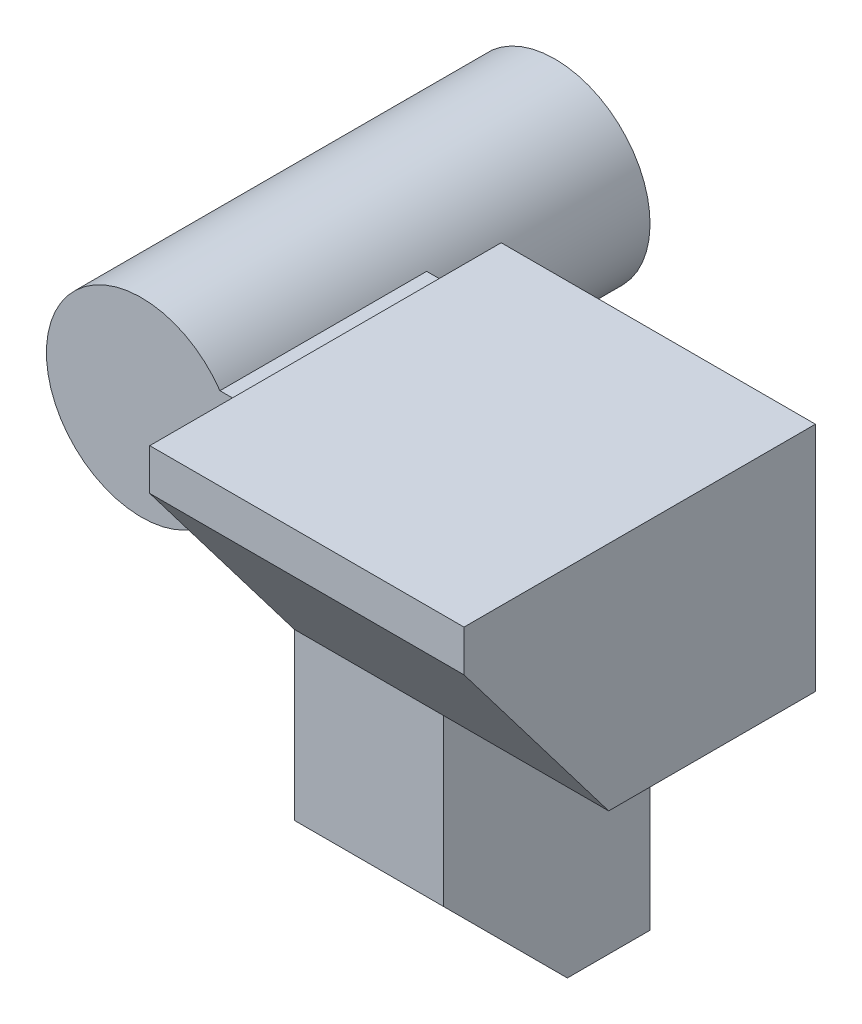
ISO-10303-21;
HEADER;
FILE_DESCRIPTION(('STEP AP214'),'2;1');
FILE_NAME('part.step','',(''),(''),'','','');
FILE_SCHEMA(('AUTOMOTIVE_DESIGN { 1 0 10303 214 1 1 1 1 }'));
ENDSEC;
DATA;
#1=APPLICATION_CONTEXT('core data for automotive mechanical design processes');
#2=APPLICATION_PROTOCOL_DEFINITION('international standard','automotive_design',2000,#1);
#3=PRODUCT_CONTEXT('',#1,'mechanical');
#4=PRODUCT('Part','Part','',(#3));
#5=PRODUCT_RELATED_PRODUCT_CATEGORY('part','',(#4));
#6=PRODUCT_DEFINITION_FORMATION('','',#4);
#7=PRODUCT_DEFINITION_CONTEXT('part definition',#1,'design');
#8=PRODUCT_DEFINITION('design','',#6,#7);
#9=PRODUCT_DEFINITION_SHAPE('','',#8);
#10=(LENGTH_UNIT() NAMED_UNIT(*) SI_UNIT(.MILLI.,.METRE.));
#11=(NAMED_UNIT(*) PLANE_ANGLE_UNIT() SI_UNIT($,.RADIAN.));
#12=(NAMED_UNIT(*) SI_UNIT($,.STERADIAN.) SOLID_ANGLE_UNIT());
#13=UNCERTAINTY_MEASURE_WITH_UNIT(LENGTH_MEASURE(1.E-05),#10,'distance_accuracy_value','');
#14=(GEOMETRIC_REPRESENTATION_CONTEXT(3) GLOBAL_UNCERTAINTY_ASSIGNED_CONTEXT((#13)) GLOBAL_UNIT_ASSIGNED_CONTEXT((#10,
#11,#12)) REPRESENTATION_CONTEXT('',''));
#15=CARTESIAN_POINT('',(0.,0.,0.));
#16=DIRECTION('',(0.,0.,1.));
#17=DIRECTION('',(1.,0.,0.));
#18=AXIS2_PLACEMENT_3D('',#15,#16,#17);
#19=CARTESIAN_POINT('',(0.,0.,5.));
#20=DIRECTION('',(0.,0.,1.));
#21=DIRECTION('',(1.,0.,0.));
#22=AXIS2_PLACEMENT_3D('',#19,#20,#21);
#23=PLANE('',#22);
#24=DIRECTION('',(1.,0.,0.));
#25=VECTOR('',#24,1.);
#26=CARTESIAN_POINT('',(0.,-1.3,5.));
#27=LINE('',#26,#25);
#28=CARTESIAN_POINT('',(-5.60263340389896,-1.3,5.));
#29=VERTEX_POINT('',#28);
#30=CARTESIAN_POINT('',(-3.8,-1.3,5.));
#31=VERTEX_POINT('',#30);
#32=EDGE_CURVE('E203',#29,#31,#27,.T.);
#33=ORIENTED_EDGE('',*,*,#32,.T.);
#34=DIRECTION('',(0.,1.,0.));
#35=VECTOR('',#34,1.);
#36=CARTESIAN_POINT('',(-3.8,-2.8,5.));
#37=LINE('',#36,#35);
#38=CARTESIAN_POINT('',(-3.8,1.3,5.));
#39=VERTEX_POINT('',#38);
#40=EDGE_CURVE('E11',#31,#39,#37,.T.);
#41=ORIENTED_EDGE('',*,*,#40,.T.);
#42=DIRECTION('',(1.,0.,0.));
#43=VECTOR('',#42,1.);
#44=CARTESIAN_POINT('',(0.,1.3,5.));
#45=LINE('',#44,#43);
#46=CARTESIAN_POINT('',(-5.60263340389896,1.3,5.));
#47=VERTEX_POINT('',#46);
#48=EDGE_CURVE('E198',#47,#39,#45,.T.);
#49=ORIENTED_EDGE('',*,*,#48,.F.);
#50=CARTESIAN_POINT('',(-7.49999999999999,0.,5.));
#51=DIRECTION('',(0.,0.,1.));
#52=DIRECTION('',(1.,0.,0.));
#53=AXIS2_PLACEMENT_3D('',#50,#51,#52);
#54=CIRCLE('',#53,2.3);
#55=EDGE_CURVE('E191',#47,#29,#54,.T.);
#56=ORIENTED_EDGE('',*,*,#55,.T.);
#57=EDGE_LOOP('',(#33,#41,#49,#56));
#58=FACE_BOUND('',#57,.T.);
#59=ADVANCED_FACE('F43',(#58),#23,.T.);
#60=CARTESIAN_POINT('',(0.,0.,0.));
#61=DIRECTION('',(0.,0.,1.));
#62=DIRECTION('',(1.,0.,0.));
#63=AXIS2_PLACEMENT_3D('',#60,#61,#62);
#64=PLANE('',#63);
#65=CARTESIAN_POINT('',(-7.49999999999999,0.,0.));
#66=DIRECTION('',(0.,0.,-1.));
#67=DIRECTION('',(-1.,0.,0.));
#68=AXIS2_PLACEMENT_3D('',#65,#66,#67);
#69=CIRCLE('',#68,2.3);
#70=CARTESIAN_POINT('',(-5.60263340389896,1.3,0.));
#71=VERTEX_POINT('',#70);
#72=CARTESIAN_POINT('',(-5.60263340389896,-1.3,0.));
#73=VERTEX_POINT('',#72);
#74=EDGE_CURVE('E173',#71,#73,#69,.T.);
#75=ORIENTED_EDGE('',*,*,#74,.F.);
#76=DIRECTION('',(1.,0.,0.));
#77=VECTOR('',#76,1.);
#78=CARTESIAN_POINT('',(0.,1.3,0.));
#79=LINE('',#78,#77);
#80=CARTESIAN_POINT('',(-3.8,1.3,0.));
#81=VERTEX_POINT('',#80);
#82=EDGE_CURVE('E197',#71,#81,#79,.T.);
#83=ORIENTED_EDGE('',*,*,#82,.T.);
#84=DIRECTION('',(0.,-1.,0.));
#85=VECTOR('',#84,1.);
#86=CARTESIAN_POINT('',(-3.8,2.8,0.));
#87=LINE('',#86,#85);
#88=CARTESIAN_POINT('',(-3.8,2.8,0.));
#89=VERTEX_POINT('',#88);
#90=EDGE_CURVE('E226',#89,#81,#87,.T.);
#91=ORIENTED_EDGE('',*,*,#90,.F.);
#92=DIRECTION('',(-1.,0.,0.));
#93=VECTOR('',#92,1.);
#94=CARTESIAN_POINT('',(-3.8,2.8,0.));
#95=LINE('',#94,#93);
#96=CARTESIAN_POINT('',(3.8,2.8,0.));
#97=VERTEX_POINT('',#96);
#98=EDGE_CURVE('E145',#97,#89,#95,.T.);
#99=ORIENTED_EDGE('',*,*,#98,.F.);
#100=DIRECTION('',(0.,1.,0.));
#101=VECTOR('',#100,1.);
#102=CARTESIAN_POINT('',(3.8,2.8,0.));
#103=LINE('',#102,#101);
#104=CARTESIAN_POINT('',(3.8,-2.8,0.));
#105=VERTEX_POINT('',#104);
#106=EDGE_CURVE('E210',#105,#97,#103,.T.);
#107=ORIENTED_EDGE('',*,*,#106,.F.);
#108=DIRECTION('',(1.,0.,0.));
#109=VECTOR('',#108,1.);
#110=CARTESIAN_POINT('',(-3.8,-2.8,0.));
#111=LINE('',#110,#109);
#112=CARTESIAN_POINT('',(-0.200000000000001,-2.8,0.));
#113=VERTEX_POINT('',#112);
#114=EDGE_CURVE('E219',#113,#105,#111,.T.);
#115=ORIENTED_EDGE('',*,*,#114,.F.);
#116=DIRECTION('',(0.,1.,0.));
#117=VECTOR('',#116,1.);
#118=CARTESIAN_POINT('',(-0.2,-9.8,0.));
#119=LINE('',#118,#117);
#120=CARTESIAN_POINT('',(-0.2,-9.8,0.));
#121=VERTEX_POINT('',#120);
#122=EDGE_CURVE('E183',#121,#113,#119,.T.);
#123=ORIENTED_EDGE('',*,*,#122,.F.);
#124=DIRECTION('',(1.,0.,0.));
#125=VECTOR('',#124,1.);
#126=CARTESIAN_POINT('',(-3.8,-9.8,0.));
#127=LINE('',#126,#125);
#128=CARTESIAN_POINT('',(-3.8,-9.8,0.));
#129=VERTEX_POINT('',#128);
#130=EDGE_CURVE('E180',#129,#121,#127,.T.);
#131=ORIENTED_EDGE('',*,*,#130,.F.);
#132=CARTESIAN_POINT('',(-3.8,-1.3,0.));
#133=VERTEX_POINT('',#132);
#134=EDGE_CURVE('E225',#133,#129,#87,.T.);
#135=ORIENTED_EDGE('',*,*,#134,.F.);
#136=DIRECTION('',(1.,0.,0.));
#137=VECTOR('',#136,1.);
#138=CARTESIAN_POINT('',(0.,-1.3,0.));
#139=LINE('',#138,#137);
#140=EDGE_CURVE('E195',#73,#133,#139,.T.);
#141=ORIENTED_EDGE('',*,*,#140,.F.);
#142=EDGE_LOOP('',(#75,#83,#91,#99,#107,#115,#123,#131,#135,#141));
#143=FACE_BOUND('',#142,.T.);
#144=ADVANCED_FACE('F255',(#143),#64,.F.);
#145=CARTESIAN_POINT('',(-3.8,-2.8,5.));
#146=DIRECTION('',(0.,1.,0.));
#147=DIRECTION('',(0.,0.,1.));
#148=AXIS2_PLACEMENT_3D('',#145,#146,#147);
#149=PLANE('',#148);
#150=DIRECTION('',(0.,0.,1.));
#151=VECTOR('',#150,1.);
#152=CARTESIAN_POINT('',(-0.2,-2.8,0.));
#153=LINE('',#152,#151);
#154=CARTESIAN_POINT('',(-0.2,-2.8,5.));
#155=VERTEX_POINT('',#154);
#156=EDGE_CURVE('E188',#113,#155,#153,.T.);
#157=ORIENTED_EDGE('',*,*,#156,.F.);
#158=ORIENTED_EDGE('',*,*,#114,.T.);
#159=DIRECTION('',(0.,0.,-1.));
#160=VECTOR('',#159,1.);
#161=CARTESIAN_POINT('',(3.8,-2.8,5.));
#162=LINE('',#161,#160);
#163=CARTESIAN_POINT('',(3.8,-2.8,5.));
#164=VERTEX_POINT('',#163);
#165=EDGE_CURVE('E151',#164,#105,#162,.T.);
#166=ORIENTED_EDGE('',*,*,#165,.F.);
#167=DIRECTION('',(1.,0.,0.));
#168=VECTOR('',#167,1.);
#169=CARTESIAN_POINT('',(-3.8,-2.8,5.));
#170=LINE('',#169,#168);
#171=EDGE_CURVE('E218',#155,#164,#170,.T.);
#172=ORIENTED_EDGE('',*,*,#171,.F.);
#173=EDGE_LOOP('',(#157,#158,#166,#172));
#174=FACE_BOUND('',#173,.T.);
#175=ADVANCED_FACE('F292',(#174),#149,.F.);
#176=CARTESIAN_POINT('',(3.8,2.8,5.));
#177=DIRECTION('',(-1.,0.,0.));
#178=DIRECTION('',(0.,-1.,0.));
#179=AXIS2_PLACEMENT_3D('',#176,#177,#178);
#180=PLANE('',#179);
#181=ORIENTED_EDGE('',*,*,#106,.T.);
#182=DIRECTION('',(0.,0.,-1.));
#183=VECTOR('',#182,1.);
#184=CARTESIAN_POINT('',(3.8,2.8,5.));
#185=LINE('',#184,#183);
#186=CARTESIAN_POINT('',(3.8,2.8,8.5));
#187=VERTEX_POINT('',#186);
#188=EDGE_CURVE('E150',#187,#97,#185,.T.);
#189=ORIENTED_EDGE('',*,*,#188,.F.);
#190=DIRECTION('',(0.,-1.,0.));
#191=VECTOR('',#190,1.);
#192=CARTESIAN_POINT('',(3.8,2.8,8.5));
#193=LINE('',#192,#191);
#194=CARTESIAN_POINT('',(3.8,1.8,8.5));
#195=VERTEX_POINT('',#194);
#196=EDGE_CURVE('E159',#187,#195,#193,.T.);
#197=ORIENTED_EDGE('',*,*,#196,.T.);
#198=DIRECTION('',(0.,-0.795828694120859,-0.605521832483262));
#199=VECTOR('',#198,1.);
#200=CARTESIAN_POINT('',(3.8,1.8,8.5));
#201=LINE('',#200,#199);
#202=EDGE_CURVE('E165',#195,#164,#201,.T.);
#203=ORIENTED_EDGE('',*,*,#202,.T.);
#204=ORIENTED_EDGE('',*,*,#165,.T.);
#205=EDGE_LOOP('',(#181,#189,#197,#203,#204));
#206=FACE_BOUND('',#205,.T.);
#207=ADVANCED_FACE('F252',(#206),#180,.F.);
#208=CARTESIAN_POINT('',(-3.8,2.8,5.));
#209=DIRECTION('',(0.,-1.,0.));
#210=DIRECTION('',(0.,0.,-1.));
#211=AXIS2_PLACEMENT_3D('',#208,#209,#210);
#212=PLANE('',#211);
#213=ORIENTED_EDGE('',*,*,#98,.T.);
#214=DIRECTION('',(0.,0.,-1.));
#215=VECTOR('',#214,1.);
#216=CARTESIAN_POINT('',(-3.8,2.8,5.));
#217=LINE('',#216,#215);
#218=CARTESIAN_POINT('',(-3.8,2.8,8.5));
#219=VERTEX_POINT('',#218);
#220=EDGE_CURVE('E139',#219,#89,#217,.T.);
#221=ORIENTED_EDGE('',*,*,#220,.F.);
#222=DIRECTION('',(1.,0.,0.));
#223=VECTOR('',#222,1.);
#224=CARTESIAN_POINT('',(-3.8,2.8,8.5));
#225=LINE('',#224,#223);
#226=EDGE_CURVE('E143',#219,#187,#225,.T.);
#227=ORIENTED_EDGE('',*,*,#226,.T.);
#228=ORIENTED_EDGE('',*,*,#188,.T.);
#229=EDGE_LOOP('',(#213,#221,#227,#228));
#230=FACE_BOUND('',#229,.T.);
#231=ADVANCED_FACE('F141',(#230),#212,.F.);
#232=CARTESIAN_POINT('',(-3.8,2.8,5.));
#233=DIRECTION('',(1.,0.,0.));
#234=DIRECTION('',(0.,1.,0.));
#235=AXIS2_PLACEMENT_3D('',#232,#233,#234);
#236=PLANE('',#235);
#237=ORIENTED_EDGE('',*,*,#90,.T.);
#238=DIRECTION('',(0.,0.,1.));
#239=VECTOR('',#238,1.);
#240=CARTESIAN_POINT('',(-3.8,1.3,0.));
#241=LINE('',#240,#239);
#242=EDGE_CURVE('E211',#81,#39,#241,.T.);
#243=ORIENTED_EDGE('',*,*,#242,.T.);
#244=ORIENTED_EDGE('',*,*,#40,.F.);
#245=DIRECTION('',(0.,0.,1.));
#246=VECTOR('',#245,1.);
#247=CARTESIAN_POINT('',(-3.8,-1.3,0.));
#248=LINE('',#247,#246);
#249=EDGE_CURVE('E213',#133,#31,#248,.T.);
#250=ORIENTED_EDGE('',*,*,#249,.F.);
#251=ORIENTED_EDGE('',*,*,#134,.T.);
#252=DIRECTION('',(0.,0.,1.));
#253=VECTOR('',#252,1.);
#254=CARTESIAN_POINT('',(-3.8,-9.8,0.));
#255=LINE('',#254,#253);
#256=CARTESIAN_POINT('',(-3.8,-9.8,1.99999999999999));
#257=VERTEX_POINT('',#256);
#258=EDGE_CURVE('E186',#129,#257,#255,.T.);
#259=ORIENTED_EDGE('',*,*,#258,.T.);
#260=DIRECTION('',(0.,-0.707106781186546,-0.707106781186549));
#261=VECTOR('',#260,1.);
#262=CARTESIAN_POINT('',(-3.8,-6.8,5.));
#263=LINE('',#262,#261);
#264=CARTESIAN_POINT('',(-3.8,-6.8,5.));
#265=VERTEX_POINT('',#264);
#266=EDGE_CURVE('E48',#257,#265,#263,.F.);
#267=ORIENTED_EDGE('',*,*,#266,.T.);
#268=DIRECTION('',(0.,-1.,0.));
#269=VECTOR('',#268,1.);
#270=CARTESIAN_POINT('',(-3.8,2.8,5.));
#271=LINE('',#270,#269);
#272=CARTESIAN_POINT('',(-3.8,-2.8,5.));
#273=VERTEX_POINT('',#272);
#274=EDGE_CURVE('E216',#273,#265,#271,.T.);
#275=ORIENTED_EDGE('',*,*,#274,.F.);
#276=DIRECTION('',(0.,-0.795828694120859,-0.605521832483262));
#277=VECTOR('',#276,1.);
#278=CARTESIAN_POINT('',(-3.8,1.8,8.5));
#279=LINE('',#278,#277);
#280=CARTESIAN_POINT('',(-3.8,1.8,8.5));
#281=VERTEX_POINT('',#280);
#282=EDGE_CURVE('E161',#281,#273,#279,.T.);
#283=ORIENTED_EDGE('',*,*,#282,.F.);
#284=DIRECTION('',(0.,-1.,0.));
#285=VECTOR('',#284,1.);
#286=CARTESIAN_POINT('',(-3.8,2.8,8.5));
#287=LINE('',#286,#285);
#288=EDGE_CURVE('E156',#219,#281,#287,.T.);
#289=ORIENTED_EDGE('',*,*,#288,.F.);
#290=ORIENTED_EDGE('',*,*,#220,.T.);
#291=EDGE_LOOP('',(#237,#243,#244,#250,#251,#259,#267,#275,#283,#289,#290));
#292=FACE_BOUND('',#291,.T.);
#293=ADVANCED_FACE('F163',(#292),#236,.F.);
#294=DIRECTION('',(1.,0.,0.));
#295=VECTOR('',#294,1.);
#296=CARTESIAN_POINT('',(-3.8,-2.8,5.));
#297=LINE('',#296,#295);
#298=EDGE_CURVE('E60',#273,#155,#297,.T.);
#299=ORIENTED_EDGE('',*,*,#298,.F.);
#300=ORIENTED_EDGE('',*,*,#274,.T.);
#301=DIRECTION('',(1.,0.,0.));
#302=VECTOR('',#301,1.);
#303=CARTESIAN_POINT('',(0.,-6.8,5.));
#304=LINE('',#303,#302);
#305=CARTESIAN_POINT('',(-0.2,-6.8,5.));
#306=VERTEX_POINT('',#305);
#307=EDGE_CURVE('E232',#265,#306,#304,.T.);
#308=ORIENTED_EDGE('',*,*,#307,.T.);
#309=DIRECTION('',(0.,1.,0.));
#310=VECTOR('',#309,1.);
#311=CARTESIAN_POINT('',(-0.2,-9.8,5.));
#312=LINE('',#311,#310);
#313=EDGE_CURVE('E178',#306,#155,#312,.T.);
#314=ORIENTED_EDGE('',*,*,#313,.T.);
#315=EDGE_LOOP('',(#299,#300,#308,#314));
#316=FACE_BOUND('',#315,.T.);
#317=ADVANCED_FACE('F241',(#316),#23,.T.);
#318=CARTESIAN_POINT('',(-7.49999999999999,0.,0.));
#319=DIRECTION('',(0.,0.,1.));
#320=DIRECTION('',(1.,0.,0.));
#321=AXIS2_PLACEMENT_3D('',#318,#319,#320);
#322=CYLINDRICAL_SURFACE('',#321,2.3);
#323=ORIENTED_EDGE('',*,*,#55,.F.);
#324=DIRECTION('',(0.,0.,1.));
#325=VECTOR('',#324,1.);
#326=CARTESIAN_POINT('',(-5.60263340389896,1.3,0.));
#327=LINE('',#326,#325);
#328=EDGE_CURVE('E208',#71,#47,#327,.T.);
#329=ORIENTED_EDGE('',*,*,#328,.F.);
#330=ORIENTED_EDGE('',*,*,#74,.T.);
#331=DIRECTION('',(0.,0.,1.));
#332=VECTOR('',#331,1.);
#333=CARTESIAN_POINT('',(-5.60263340389896,-1.3,0.));
#334=LINE('',#333,#332);
#335=EDGE_CURVE('E200',#73,#29,#334,.T.);
#336=ORIENTED_EDGE('',*,*,#335,.T.);
#337=EDGE_LOOP('',(#323,#329,#330,#336));
#338=FACE_BOUND('',#337,.T.);
#339=CARTESIAN_POINT('',(-7.49999999999999,0.,-5.));
#340=DIRECTION('',(0.,0.,-1.));
#341=DIRECTION('',(-1.,0.,0.));
#342=AXIS2_PLACEMENT_3D('',#339,#340,#341);
#343=CIRCLE('',#342,2.3);
#344=CARTESIAN_POINT('',(-9.79999999999999,0.,-5.));
#345=VERTEX_POINT('',#344);
#346=EDGE_CURVE('E175',#345,#345,#343,.T.);
#347=ORIENTED_EDGE('',*,*,#346,.F.);
#348=EDGE_LOOP('',(#347));
#349=FACE_BOUND('',#348,.T.);
#350=ADVANCED_FACE('F296',(#338,#349),#322,.T.);
#351=CARTESIAN_POINT('',(0.,1.3,0.));
#352=DIRECTION('',(0.,-1.,0.));
#353=DIRECTION('',(0.,0.,-1.));
#354=AXIS2_PLACEMENT_3D('',#351,#352,#353);
#355=PLANE('',#354);
#356=ORIENTED_EDGE('',*,*,#48,.T.);
#357=ORIENTED_EDGE('',*,*,#242,.F.);
#358=ORIENTED_EDGE('',*,*,#82,.F.);
#359=ORIENTED_EDGE('',*,*,#328,.T.);
#360=EDGE_LOOP('',(#356,#357,#358,#359));
#361=FACE_BOUND('',#360,.T.);
#362=ADVANCED_FACE('F262',(#361),#355,.F.);
#363=CARTESIAN_POINT('',(0.,-1.3,0.));
#364=DIRECTION('',(0.,-1.,0.));
#365=DIRECTION('',(0.,0.,-1.));
#366=AXIS2_PLACEMENT_3D('',#363,#364,#365);
#367=PLANE('',#366);
#368=ORIENTED_EDGE('',*,*,#32,.F.);
#369=ORIENTED_EDGE('',*,*,#335,.F.);
#370=ORIENTED_EDGE('',*,*,#140,.T.);
#371=ORIENTED_EDGE('',*,*,#249,.T.);
#372=EDGE_LOOP('',(#368,#369,#370,#371));
#373=FACE_BOUND('',#372,.T.);
#374=ADVANCED_FACE('F269',(#373),#367,.T.);
#375=CARTESIAN_POINT('',(-0.2,-9.8,0.));
#376=DIRECTION('',(1.,0.,0.));
#377=DIRECTION('',(0.,1.,0.));
#378=AXIS2_PLACEMENT_3D('',#375,#376,#377);
#379=PLANE('',#378);
#380=ORIENTED_EDGE('',*,*,#313,.F.);
#381=DIRECTION('',(0.,0.707106781186546,0.707106781186549));
#382=VECTOR('',#381,1.);
#383=CARTESIAN_POINT('',(-0.2,-10.8,0.999999999999991));
#384=LINE('',#383,#382);
#385=CARTESIAN_POINT('',(-0.2,-9.8,1.99999999999999));
#386=VERTEX_POINT('',#385);
#387=EDGE_CURVE('E235',#306,#386,#384,.F.);
#388=ORIENTED_EDGE('',*,*,#387,.T.);
#389=DIRECTION('',(0.,0.,1.));
#390=VECTOR('',#389,1.);
#391=CARTESIAN_POINT('',(-0.2,-9.8,0.));
#392=LINE('',#391,#390);
#393=EDGE_CURVE('E192',#121,#386,#392,.T.);
#394=ORIENTED_EDGE('',*,*,#393,.F.);
#395=ORIENTED_EDGE('',*,*,#122,.T.);
#396=ORIENTED_EDGE('',*,*,#156,.T.);
#397=EDGE_LOOP('',(#380,#388,#394,#395,#396));
#398=FACE_BOUND('',#397,.T.);
#399=ADVANCED_FACE('F244',(#398),#379,.T.);
#400=CARTESIAN_POINT('',(-3.8,-9.8,0.));
#401=DIRECTION('',(0.,-1.,0.));
#402=DIRECTION('',(0.,0.,-1.));
#403=AXIS2_PLACEMENT_3D('',#400,#401,#402);
#404=PLANE('',#403);
#405=ORIENTED_EDGE('',*,*,#393,.T.);
#406=DIRECTION('',(-1.,0.,0.));
#407=VECTOR('',#406,1.);
#408=CARTESIAN_POINT('',(-3.8,-9.8,1.99999999999999));
#409=LINE('',#408,#407);
#410=EDGE_CURVE('E68',#386,#257,#409,.T.);
#411=ORIENTED_EDGE('',*,*,#410,.T.);
#412=ORIENTED_EDGE('',*,*,#258,.F.);
#413=ORIENTED_EDGE('',*,*,#130,.T.);
#414=EDGE_LOOP('',(#405,#411,#412,#413));
#415=FACE_BOUND('',#414,.T.);
#416=ADVANCED_FACE('F273',(#415),#404,.T.);
#417=CARTESIAN_POINT('',(-7.49999999999999,0.,-5.));
#418=DIRECTION('',(0.,0.,-1.));
#419=DIRECTION('',(-1.,0.,0.));
#420=AXIS2_PLACEMENT_3D('',#417,#418,#419);
#421=PLANE('',#420);
#422=ORIENTED_EDGE('',*,*,#346,.T.);
#423=EDGE_LOOP('',(#422));
#424=FACE_BOUND('',#423,.T.);
#425=ADVANCED_FACE('F275',(#424),#421,.T.);
#426=CARTESIAN_POINT('',(0.,-6.8,5.));
#427=DIRECTION('',(0.,0.707106781186549,-0.707106781186546));
#428=DIRECTION('',(1.,0.,0.));
#429=AXIS2_PLACEMENT_3D('',#426,#427,#428);
#430=PLANE('',#429);
#431=ORIENTED_EDGE('',*,*,#266,.F.);
#432=ORIENTED_EDGE('',*,*,#410,.F.);
#433=ORIENTED_EDGE('',*,*,#387,.F.);
#434=ORIENTED_EDGE('',*,*,#307,.F.);
#435=EDGE_LOOP('',(#431,#432,#433,#434));
#436=FACE_BOUND('',#435,.T.);
#437=ADVANCED_FACE('F46',(#436),#430,.F.);
#438=CARTESIAN_POINT('',(-3.8,1.8,8.5));
#439=DIRECTION('',(0.,-0.605521832483262,0.795828694120859));
#440=DIRECTION('',(0.,-0.795828694120859,-0.605521832483262));
#441=AXIS2_PLACEMENT_3D('',#438,#439,#440);
#442=PLANE('',#441);
#443=ORIENTED_EDGE('',*,*,#202,.F.);
#444=DIRECTION('',(1.,0.,0.));
#445=VECTOR('',#444,1.);
#446=CARTESIAN_POINT('',(-3.8,1.8,8.5));
#447=LINE('',#446,#445);
#448=EDGE_CURVE('E160',#281,#195,#447,.T.);
#449=ORIENTED_EDGE('',*,*,#448,.F.);
#450=ORIENTED_EDGE('',*,*,#282,.T.);
#451=ORIENTED_EDGE('',*,*,#298,.T.);
#452=ORIENTED_EDGE('',*,*,#171,.T.);
#453=EDGE_LOOP('',(#443,#449,#450,#451,#452));
#454=FACE_BOUND('',#453,.T.);
#455=ADVANCED_FACE('F250',(#454),#442,.T.);
#456=CARTESIAN_POINT('',(-3.8,2.8,8.5));
#457=DIRECTION('',(0.,0.,1.));
#458=DIRECTION('',(1.,0.,0.));
#459=AXIS2_PLACEMENT_3D('',#456,#457,#458);
#460=PLANE('',#459);
#461=ORIENTED_EDGE('',*,*,#196,.F.);
#462=ORIENTED_EDGE('',*,*,#226,.F.);
#463=ORIENTED_EDGE('',*,*,#288,.T.);
#464=ORIENTED_EDGE('',*,*,#448,.T.);
#465=EDGE_LOOP('',(#461,#462,#463,#464));
#466=FACE_BOUND('',#465,.T.);
#467=ADVANCED_FACE('F155',(#466),#460,.T.);
#468=CLOSED_SHELL('',(#59,#144,#175,#207,#231,#293,#317,#350,#362,#374,#399,#416,#425,#437,#455,#467));
#469=MANIFOLD_SOLID_BREP('B2',#468);
#470=ADVANCED_BREP_SHAPE_REPRESENTATION('',(#18,#469),#14);
#471=SHAPE_DEFINITION_REPRESENTATION(#9,#470);
ENDSEC;
END-ISO-10303-21;
